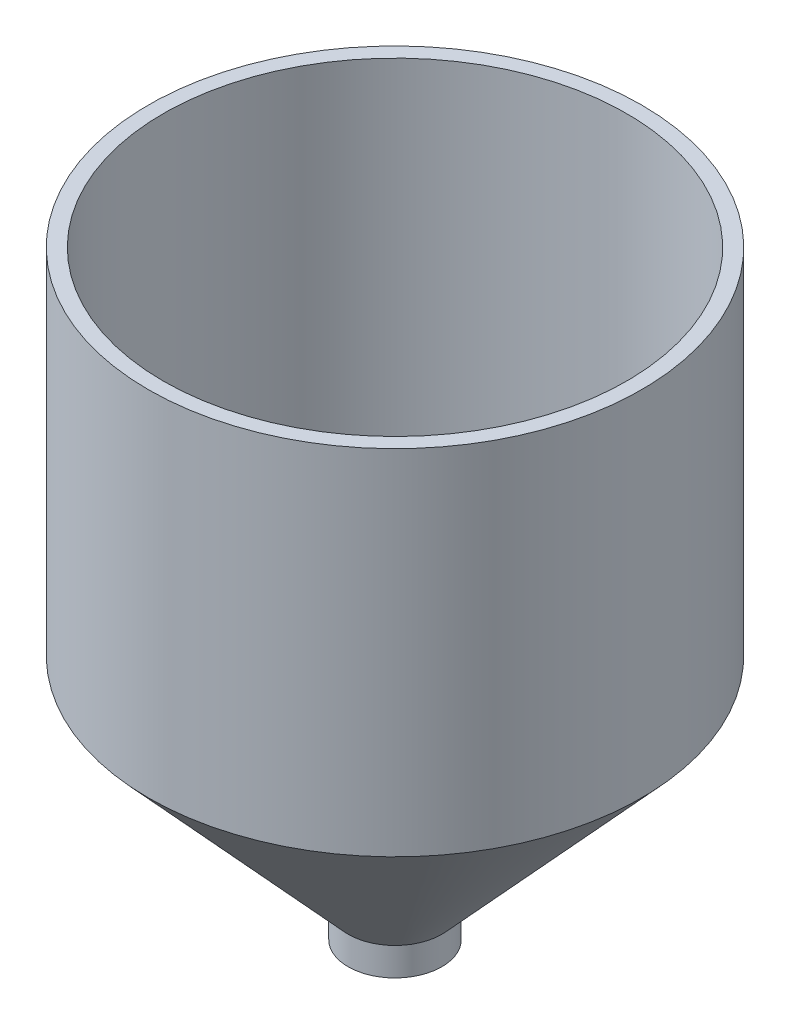
ISO-10303-21;
HEADER;
FILE_DESCRIPTION(('STEP AP214'),'2;1');
FILE_NAME('part.step','',(''),(''),'','','');
FILE_SCHEMA(('AUTOMOTIVE_DESIGN { 1 0 10303 214 1 1 1 1 }'));
ENDSEC;
DATA;
#1=APPLICATION_CONTEXT('core data for automotive mechanical design processes');
#2=APPLICATION_PROTOCOL_DEFINITION('international standard','automotive_design',2000,#1);
#3=PRODUCT_CONTEXT('',#1,'mechanical');
#4=PRODUCT('Part','Part','',(#3));
#5=PRODUCT_RELATED_PRODUCT_CATEGORY('part','',(#4));
#6=PRODUCT_DEFINITION_FORMATION('','',#4);
#7=PRODUCT_DEFINITION_CONTEXT('part definition',#1,'design');
#8=PRODUCT_DEFINITION('design','',#6,#7);
#9=PRODUCT_DEFINITION_SHAPE('','',#8);
#10=(LENGTH_UNIT() NAMED_UNIT(*) SI_UNIT(.MILLI.,.METRE.));
#11=(NAMED_UNIT(*) PLANE_ANGLE_UNIT() SI_UNIT($,.RADIAN.));
#12=(NAMED_UNIT(*) SI_UNIT($,.STERADIAN.) SOLID_ANGLE_UNIT());
#13=UNCERTAINTY_MEASURE_WITH_UNIT(LENGTH_MEASURE(1.E-05),#10,'distance_accuracy_value','');
#14=(GEOMETRIC_REPRESENTATION_CONTEXT(3) GLOBAL_UNCERTAINTY_ASSIGNED_CONTEXT((#13)) GLOBAL_UNIT_ASSIGNED_CONTEXT((#10,
#11,#12)) REPRESENTATION_CONTEXT('',''));
#15=CARTESIAN_POINT('',(0.,0.,0.));
#16=DIRECTION('',(0.,0.,1.));
#17=DIRECTION('',(1.,0.,0.));
#18=AXIS2_PLACEMENT_3D('',#15,#16,#17);
#19=CARTESIAN_POINT('',(0.,-151.9,0.));
#20=DIRECTION('',(0.,1.,0.));
#21=DIRECTION('',(0.,0.,1.));
#22=AXIS2_PLACEMENT_3D('',#19,#20,#21);
#23=CYLINDRICAL_SURFACE('',#22,10.);
#24=CARTESIAN_POINT('',(0.,-121.9,0.));
#25=DIRECTION('',(0.,-1.,0.));
#26=DIRECTION('',(0.,0.,-1.));
#27=AXIS2_PLACEMENT_3D('',#24,#25,#26);
#28=CIRCLE('',#27,10.);
#29=CARTESIAN_POINT('',(0.,-121.9,-10.));
#30=VERTEX_POINT('',#29);
#31=EDGE_CURVE('E50',#30,#30,#28,.T.);
#32=ORIENTED_EDGE('',*,*,#31,.T.);
#33=EDGE_LOOP('',(#32));
#34=FACE_BOUND('',#33,.T.);
#35=CARTESIAN_POINT('',(0.,-127.9,0.));
#36=DIRECTION('',(0.,-1.,0.));
#37=DIRECTION('',(0.,0.,-1.));
#38=AXIS2_PLACEMENT_3D('',#35,#36,#37);
#39=CIRCLE('',#38,10.);
#40=CARTESIAN_POINT('',(0.,-127.9,-10.));
#41=VERTEX_POINT('',#40);
#42=EDGE_CURVE('E41',#41,#41,#39,.T.);
#43=ORIENTED_EDGE('',*,*,#42,.F.);
#44=EDGE_LOOP('',(#43));
#45=FACE_BOUND('',#44,.T.);
#46=ADVANCED_FACE('F37',(#34,#45),#23,.T.);
#47=CARTESIAN_POINT('',(0.,-75.4,0.));
#48=DIRECTION('',(0.,1.,0.));
#49=DIRECTION('',(0.,0.,1.));
#50=AXIS2_PLACEMENT_3D('',#47,#48,#49);
#51=CYLINDRICAL_SURFACE('',#50,52.6);
#52=CARTESIAN_POINT('',(0.,-75.4,0.));
#53=DIRECTION('',(0.,-1.,0.));
#54=DIRECTION('',(0.,0.,-1.));
#55=AXIS2_PLACEMENT_3D('',#52,#53,#54);
#56=CIRCLE('',#55,52.6);
#57=CARTESIAN_POINT('',(0.,-75.4,-52.6));
#58=VERTEX_POINT('',#57);
#59=EDGE_CURVE('E45',#58,#58,#56,.T.);
#60=ORIENTED_EDGE('',*,*,#59,.F.);
#61=EDGE_LOOP('',(#60));
#62=FACE_BOUND('',#61,.T.);
#63=CARTESIAN_POINT('',(0.,0.,0.));
#64=DIRECTION('',(0.,1.,0.));
#65=DIRECTION('',(0.,0.,1.));
#66=AXIS2_PLACEMENT_3D('',#63,#64,#65);
#67=CIRCLE('',#66,52.6);
#68=CARTESIAN_POINT('',(0.,0.,52.6));
#69=VERTEX_POINT('',#68);
#70=EDGE_CURVE('E11',#69,#69,#67,.T.);
#71=ORIENTED_EDGE('',*,*,#70,.F.);
#72=EDGE_LOOP('',(#71));
#73=FACE_BOUND('',#72,.T.);
#74=ADVANCED_FACE('F39',(#62,#73),#51,.T.);
#75=CARTESIAN_POINT('',(0.,0.,0.));
#76=DIRECTION('',(0.,1.,0.));
#77=DIRECTION('',(0.,0.,1.));
#78=AXIS2_PLACEMENT_3D('',#75,#76,#77);
#79=PLANE('',#78);
#80=CARTESIAN_POINT('',(0.,0.,0.));
#81=DIRECTION('',(0.,1.,0.));
#82=DIRECTION('',(0.,0.,1.));
#83=AXIS2_PLACEMENT_3D('',#80,#81,#82);
#84=CIRCLE('',#83,49.425);
#85=CARTESIAN_POINT('',(0.,0.,49.425));
#86=VERTEX_POINT('',#85);
#87=EDGE_CURVE('E85',#86,#86,#84,.T.);
#88=ORIENTED_EDGE('',*,*,#87,.F.);
#89=EDGE_LOOP('',(#88));
#90=FACE_BOUND('',#89,.T.);
#91=ORIENTED_EDGE('',*,*,#70,.T.);
#92=EDGE_LOOP('',(#91));
#93=FACE_BOUND('',#92,.T.);
#94=ADVANCED_FACE('F74',(#90,#93),#79,.T.);
#95=CARTESIAN_POINT('',(0.,-121.9,0.));
#96=DIRECTION('',(0.,1.,0.));
#97=DIRECTION('',(0.,0.,1.));
#98=AXIS2_PLACEMENT_3D('',#95,#96,#97);
#99=CONICAL_SURFACE('',#98,10.,0.741655041246264);
#100=ORIENTED_EDGE('',*,*,#31,.F.);
#101=EDGE_LOOP('',(#100));
#102=FACE_BOUND('',#101,.T.);
#103=ORIENTED_EDGE('',*,*,#59,.T.);
#104=EDGE_LOOP('',(#103));
#105=FACE_BOUND('',#104,.T.);
#106=ADVANCED_FACE('F71',(#102,#105),#99,.T.);
#107=CARTESIAN_POINT('',(0.,-127.9,0.));
#108=DIRECTION('',(0.,-1.,0.));
#109=DIRECTION('',(0.,0.,-1.));
#110=AXIS2_PLACEMENT_3D('',#107,#108,#109);
#111=PLANE('',#110);
#112=CARTESIAN_POINT('',(0.,-127.9,0.));
#113=DIRECTION('',(0.,-1.,0.));
#114=DIRECTION('',(0.,0.,-1.));
#115=AXIS2_PLACEMENT_3D('',#112,#113,#114);
#116=CIRCLE('',#115,6.825);
#117=CARTESIAN_POINT('',(0.,-127.9,-6.825));
#118=VERTEX_POINT('',#117);
#119=EDGE_CURVE('E89',#118,#118,#116,.T.);
#120=ORIENTED_EDGE('',*,*,#119,.F.);
#121=EDGE_LOOP('',(#120));
#122=FACE_BOUND('',#121,.T.);
#123=ORIENTED_EDGE('',*,*,#42,.T.);
#124=EDGE_LOOP('',(#123));
#125=FACE_BOUND('',#124,.T.);
#126=ADVANCED_FACE('F69',(#122,#125),#111,.T.);
#127=CARTESIAN_POINT('',(0.,-151.9,0.));
#128=DIRECTION('',(0.,1.,0.));
#129=DIRECTION('',(0.,0.,1.));
#130=AXIS2_PLACEMENT_3D('',#127,#128,#129);
#131=CYLINDRICAL_SURFACE('',#130,6.825);
#132=CARTESIAN_POINT('',(0.,-120.665510855556,0.));
#133=DIRECTION('',(0.,1.,0.));
#134=DIRECTION('',(0.,0.,1.));
#135=AXIS2_PLACEMENT_3D('',#132,#133,#134);
#136=CIRCLE('',#135,6.825);
#137=CARTESIAN_POINT('',(0.,-120.665510855556,6.82499999999999));
#138=VERTEX_POINT('',#137);
#139=EDGE_CURVE('E92',#138,#138,#136,.F.);
#140=ORIENTED_EDGE('',*,*,#139,.F.);
#141=EDGE_LOOP('',(#140));
#142=FACE_BOUND('',#141,.T.);
#143=ORIENTED_EDGE('',*,*,#119,.T.);
#144=EDGE_LOOP('',(#143));
#145=FACE_BOUND('',#144,.T.);
#146=ADVANCED_FACE('F101',(#142,#145),#131,.F.);
#147=CARTESIAN_POINT('',(0.,-75.4,0.));
#148=DIRECTION('',(0.,1.,0.));
#149=DIRECTION('',(0.,0.,1.));
#150=AXIS2_PLACEMENT_3D('',#147,#148,#149);
#151=CYLINDRICAL_SURFACE('',#150,49.425);
#152=CARTESIAN_POINT('',(0.,-74.1655108555556,0.));
#153=DIRECTION('',(0.,1.,0.));
#154=DIRECTION('',(0.,0.,1.));
#155=AXIS2_PLACEMENT_3D('',#152,#153,#154);
#156=CIRCLE('',#155,49.425);
#157=CARTESIAN_POINT('',(0.,-74.1655108555557,49.425));
#158=VERTEX_POINT('',#157);
#159=EDGE_CURVE('E88',#158,#158,#156,.F.);
#160=ORIENTED_EDGE('',*,*,#159,.T.);
#161=EDGE_LOOP('',(#160));
#162=FACE_BOUND('',#161,.T.);
#163=ORIENTED_EDGE('',*,*,#87,.T.);
#164=EDGE_LOOP('',(#163));
#165=FACE_BOUND('',#164,.T.);
#166=ADVANCED_FACE('F104',(#162,#165),#151,.F.);
#167=CARTESIAN_POINT('',(0.,-119.75525834238,0.));
#168=DIRECTION('',(0.,1.,0.));
#169=DIRECTION('',(0.,0.,1.));
#170=AXIS2_PLACEMENT_3D('',#167,#168,#169);
#171=CONICAL_SURFACE('',#170,7.65890875400619,0.741655041246264);
#172=CARTESIAN_POINT('',(0.,-120.665510855556,6.82499999999999));
#173=CARTESIAN_POINT('',(0.,-120.181135855556,7.26874999999999));
#174=CARTESIAN_POINT('',(0.,-119.696760855556,7.71249999999999));
#175=CARTESIAN_POINT('',(0.,-118.728010855556,8.59999999999999));
#176=CARTESIAN_POINT('',(0.,-118.243635855556,9.04374999999999));
#177=CARTESIAN_POINT('',(0.,-117.274885855556,9.93124999999999));
#178=CARTESIAN_POINT('',(0.,-116.790510855556,10.375));
#179=CARTESIAN_POINT('',(0.,-115.821760855556,11.2625));
#180=CARTESIAN_POINT('',(0.,-115.337385855556,11.70625));
#181=CARTESIAN_POINT('',(0.,-114.368635855556,12.59375));
#182=CARTESIAN_POINT('',(0.,-113.884260855556,13.0375));
#183=CARTESIAN_POINT('',(0.,-112.915510855556,13.925));
#184=CARTESIAN_POINT('',(0.,-112.431135855556,14.36875));
#185=CARTESIAN_POINT('',(0.,-111.462385855556,15.25625));
#186=CARTESIAN_POINT('',(0.,-110.978010855556,15.7));
#187=CARTESIAN_POINT('',(0.,-110.009260855556,16.5875));
#188=CARTESIAN_POINT('',(0.,-109.524885855556,17.03125));
#189=CARTESIAN_POINT('',(0.,-108.556135855556,17.91875));
#190=CARTESIAN_POINT('',(0.,-108.071760855556,18.3625));
#191=CARTESIAN_POINT('',(0.,-107.103010855556,19.25));
#192=CARTESIAN_POINT('',(0.,-106.618635855556,19.69375));
#193=CARTESIAN_POINT('',(0.,-105.649885855556,20.58125));
#194=CARTESIAN_POINT('',(0.,-105.165510855556,21.025));
#195=CARTESIAN_POINT('',(0.,-104.196760855556,21.9125));
#196=CARTESIAN_POINT('',(0.,-103.712385855556,22.35625));
#197=CARTESIAN_POINT('',(0.,-102.743635855556,23.24375));
#198=CARTESIAN_POINT('',(0.,-102.259260855556,23.6875));
#199=CARTESIAN_POINT('',(0.,-101.290510855556,24.575));
#200=CARTESIAN_POINT('',(0.,-100.806135855556,25.01875));
#201=CARTESIAN_POINT('',(0.,-99.8373858555557,25.90625));
#202=CARTESIAN_POINT('',(0.,-99.3530108555557,26.35));
#203=CARTESIAN_POINT('',(0.,-98.3842608555557,27.2375));
#204=CARTESIAN_POINT('',(0.,-97.8998858555557,27.68125));
#205=CARTESIAN_POINT('',(0.,-96.9311358555557,28.56875));
#206=CARTESIAN_POINT('',(0.,-96.4467608555557,29.0125));
#207=CARTESIAN_POINT('',(0.,-95.4780108555557,29.9));
#208=CARTESIAN_POINT('',(0.,-94.9936358555557,30.34375));
#209=CARTESIAN_POINT('',(0.,-94.0248858555557,31.23125));
#210=CARTESIAN_POINT('',(0.,-93.5405108555557,31.675));
#211=CARTESIAN_POINT('',(0.,-92.5717608555557,32.5625));
#212=CARTESIAN_POINT('',(0.,-92.0873858555557,33.00625));
#213=CARTESIAN_POINT('',(0.,-91.1186358555557,33.89375));
#214=CARTESIAN_POINT('',(0.,-90.6342608555557,34.3375));
#215=CARTESIAN_POINT('',(0.,-89.6655108555557,35.225));
#216=CARTESIAN_POINT('',(0.,-89.1811358555557,35.66875));
#217=CARTESIAN_POINT('',(0.,-88.2123858555557,36.55625));
#218=CARTESIAN_POINT('',(0.,-87.7280108555557,37.));
#219=CARTESIAN_POINT('',(0.,-86.7592608555557,37.8875));
#220=CARTESIAN_POINT('',(0.,-86.2748858555557,38.33125));
#221=CARTESIAN_POINT('',(0.,-85.3061358555557,39.21875));
#222=CARTESIAN_POINT('',(0.,-84.8217608555557,39.6625));
#223=CARTESIAN_POINT('',(0.,-83.8530108555557,40.55));
#224=CARTESIAN_POINT('',(0.,-83.3686358555557,40.99375));
#225=CARTESIAN_POINT('',(0.,-82.3998858555557,41.88125));
#226=CARTESIAN_POINT('',(0.,-81.9155108555557,42.325));
#227=CARTESIAN_POINT('',(0.,-80.9467608555557,43.2125));
#228=CARTESIAN_POINT('',(0.,-80.4623858555557,43.65625));
#229=CARTESIAN_POINT('',(0.,-79.4936358555557,44.54375));
#230=CARTESIAN_POINT('',(0.,-79.0092608555557,44.9875));
#231=CARTESIAN_POINT('',(0.,-78.0405108555557,45.875));
#232=CARTESIAN_POINT('',(0.,-77.5561358555557,46.31875));
#233=CARTESIAN_POINT('',(0.,-76.5873858555557,47.20625));
#234=CARTESIAN_POINT('',(0.,-76.1030108555557,47.65));
#235=CARTESIAN_POINT('',(0.,-75.1342608555557,48.5375));
#236=CARTESIAN_POINT('',(0.,-74.6498858555557,48.98125));
#237=CARTESIAN_POINT('',(0.,-74.1655108555557,49.425));
#238=B_SPLINE_CURVE_WITH_KNOTS('',3,(#172,#173,#174,#175,#176,#177,#178,#179,#180,#181,#182,
#183,#184,#185,#186,#187,#188,#189,#190,#191,#192,#193,#194,#195,#196,#197,#198,#199,#200,#201,
#202,#203,#204,#205,#206,#207,#208,#209,#210,#211,#212,#213,#214,#215,#216,#217,#218,#219,#220,
#221,#222,#223,#224,#225,#226,#227,#228,#229,#230,#231,#232,#233,#234,#235,#236,#237),
.UNSPECIFIED.,.F.,.F.,(4,2,2,2,2,2,2,2,2,2,2,2,2,2,2,2,2,2,2,2,2,2,2,2,2,2,2,2,2,2,2,2,4),(0.,
1.97073560583986,3.94147121167972,5.91220681751958,7.88294242335944,9.8536780291993,
11.8244136350392,13.795149240879,15.7658848467189,17.7366204525587,19.7073560583986,
21.6780916642385,23.6488272700783,25.6195628759182,27.590298481758,29.5610340875979,
31.5317696934378,33.5025052992776,35.4732409051175,37.4439765109573,39.4147121167972,
41.3854477226371,43.3561833284769,45.3269189343168,47.2976545401566,49.2683901459965,
51.2391257518363,53.2098613576762,55.1805969635161,57.1513325693559,59.1220681751958,
61.0928037810357,63.0635393868755),.UNSPECIFIED.);
#239=EDGE_CURVE('BSEAM98',#138,#158,#238,.T.);
#240=ORIENTED_EDGE('',*,*,#139,.T.);
#241=ORIENTED_EDGE('',*,*,#159,.F.);
#242=ORIENTED_EDGE('',*,*,#239,.T.);
#243=ORIENTED_EDGE('',*,*,#239,.F.);
#244=EDGE_LOOP('',(#240,#242,#241,#243));
#245=FACE_BOUND('',#244,.T.);
#246=ADVANCED_FACE('F98',(#245),#171,.F.);
#247=CLOSED_SHELL('',(#46,#74,#94,#106,#126,#146,#166,#246));
#248=MANIFOLD_SOLID_BREP('B2',#247);
#249=ADVANCED_BREP_SHAPE_REPRESENTATION('',(#18,#248),#14);
#250=SHAPE_DEFINITION_REPRESENTATION(#9,#249);
ENDSEC;
END-ISO-10303-21;
